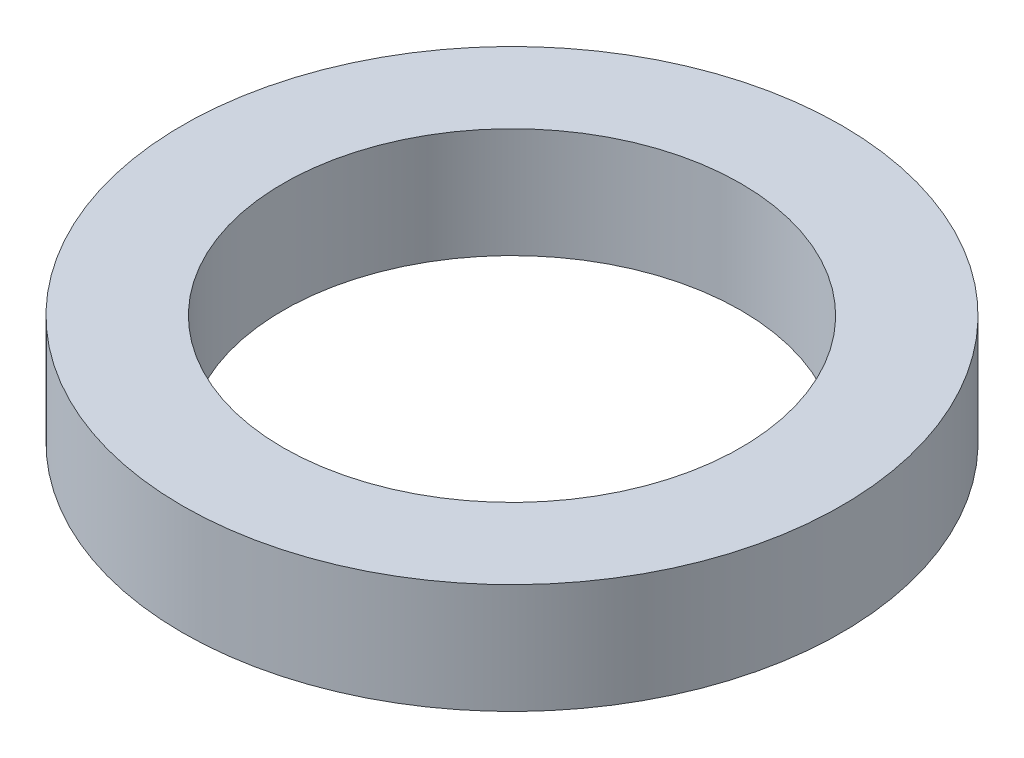
ISO-10303-21;
HEADER;
FILE_DESCRIPTION(('STEP AP214'),'2;1');
FILE_NAME('part.step','',(''),(''),'','','');
FILE_SCHEMA(('AUTOMOTIVE_DESIGN { 1 0 10303 214 1 1 1 1 }'));
ENDSEC;
DATA;
#1=APPLICATION_CONTEXT('core data for automotive mechanical design processes');
#2=APPLICATION_PROTOCOL_DEFINITION('international standard','automotive_design',2000,#1);
#3=PRODUCT_CONTEXT('',#1,'mechanical');
#4=PRODUCT('Part','Part','',(#3));
#5=PRODUCT_RELATED_PRODUCT_CATEGORY('part','',(#4));
#6=PRODUCT_DEFINITION_FORMATION('','',#4);
#7=PRODUCT_DEFINITION_CONTEXT('part definition',#1,'design');
#8=PRODUCT_DEFINITION('design','',#6,#7);
#9=PRODUCT_DEFINITION_SHAPE('','',#8);
#10=(LENGTH_UNIT() NAMED_UNIT(*) SI_UNIT(.MILLI.,.METRE.));
#11=(NAMED_UNIT(*) PLANE_ANGLE_UNIT() SI_UNIT($,.RADIAN.));
#12=(NAMED_UNIT(*) SI_UNIT($,.STERADIAN.) SOLID_ANGLE_UNIT());
#13=UNCERTAINTY_MEASURE_WITH_UNIT(LENGTH_MEASURE(1.E-05),#10,'distance_accuracy_value','');
#14=(GEOMETRIC_REPRESENTATION_CONTEXT(3) GLOBAL_UNCERTAINTY_ASSIGNED_CONTEXT((#13)) GLOBAL_UNIT_ASSIGNED_CONTEXT((#10,
#11,#12)) REPRESENTATION_CONTEXT('',''));
#15=CARTESIAN_POINT('',(0.,0.,0.));
#16=DIRECTION('',(0.,0.,1.));
#17=DIRECTION('',(1.,0.,0.));
#18=AXIS2_PLACEMENT_3D('',#15,#16,#17);
#19=CARTESIAN_POINT('',(0.,3.,0.));
#20=DIRECTION('',(0.,1.,0.));
#21=DIRECTION('',(0.,0.,1.));
#22=AXIS2_PLACEMENT_3D('',#19,#20,#21);
#23=PLANE('',#22);
#24=CARTESIAN_POINT('',(0.,3.,0.));
#25=DIRECTION('',(0.,1.,0.));
#26=DIRECTION('',(0.,0.,1.));
#27=AXIS2_PLACEMENT_3D('',#24,#25,#26);
#28=CIRCLE('',#27,9.);
#29=CARTESIAN_POINT('',(0.,3.,9.));
#30=VERTEX_POINT('',#29);
#31=EDGE_CURVE('E10',#30,#30,#28,.T.);
#32=ORIENTED_EDGE('',*,*,#31,.T.);
#33=EDGE_LOOP('',(#32));
#34=FACE_BOUND('',#33,.T.);
#35=CARTESIAN_POINT('',(0.,3.,0.));
#36=DIRECTION('',(0.,1.,0.));
#37=DIRECTION('',(0.,0.,1.));
#38=AXIS2_PLACEMENT_3D('',#35,#36,#37);
#39=CIRCLE('',#38,6.25);
#40=CARTESIAN_POINT('',(0.,3.,6.25));
#41=VERTEX_POINT('',#40);
#42=EDGE_CURVE('E42',#41,#41,#39,.T.);
#43=ORIENTED_EDGE('',*,*,#42,.F.);
#44=EDGE_LOOP('',(#43));
#45=FACE_BOUND('',#44,.T.);
#46=ADVANCED_FACE('F31',(#34,#45),#23,.T.);
#47=CARTESIAN_POINT('',(0.,0.,0.));
#48=DIRECTION('',(0.,1.,0.));
#49=DIRECTION('',(0.,0.,1.));
#50=AXIS2_PLACEMENT_3D('',#47,#48,#49);
#51=PLANE('',#50);
#52=CARTESIAN_POINT('',(0.,0.,0.));
#53=DIRECTION('',(0.,1.,0.));
#54=DIRECTION('',(0.,0.,1.));
#55=AXIS2_PLACEMENT_3D('',#52,#53,#54);
#56=CIRCLE('',#55,9.);
#57=CARTESIAN_POINT('',(0.,0.,9.));
#58=VERTEX_POINT('',#57);
#59=EDGE_CURVE('E35',#58,#58,#56,.T.);
#60=ORIENTED_EDGE('',*,*,#59,.F.);
#61=EDGE_LOOP('',(#60));
#62=FACE_BOUND('',#61,.T.);
#63=CARTESIAN_POINT('',(0.,0.,0.));
#64=DIRECTION('',(0.,1.,0.));
#65=DIRECTION('',(0.,0.,1.));
#66=AXIS2_PLACEMENT_3D('',#63,#64,#65);
#67=CIRCLE('',#66,6.25);
#68=CARTESIAN_POINT('',(0.,0.,6.25));
#69=VERTEX_POINT('',#68);
#70=EDGE_CURVE('E44',#69,#69,#67,.T.);
#71=ORIENTED_EDGE('',*,*,#70,.T.);
#72=EDGE_LOOP('',(#71));
#73=FACE_BOUND('',#72,.T.);
#74=ADVANCED_FACE('F54',(#62,#73),#51,.F.);
#75=CARTESIAN_POINT('',(0.,3.,0.));
#76=DIRECTION('',(0.,-1.,0.));
#77=DIRECTION('',(0.,0.,-1.));
#78=AXIS2_PLACEMENT_3D('',#75,#76,#77);
#79=CYLINDRICAL_SURFACE('',#78,9.);
#80=ORIENTED_EDGE('',*,*,#31,.F.);
#81=EDGE_LOOP('',(#80));
#82=FACE_BOUND('',#81,.T.);
#83=ORIENTED_EDGE('',*,*,#59,.T.);
#84=EDGE_LOOP('',(#83));
#85=FACE_BOUND('',#84,.T.);
#86=ADVANCED_FACE('F33',(#82,#85),#79,.T.);
#87=CARTESIAN_POINT('',(0.,3.,0.));
#88=DIRECTION('',(0.,-1.,0.));
#89=DIRECTION('',(0.,0.,-1.));
#90=AXIS2_PLACEMENT_3D('',#87,#88,#89);
#91=CYLINDRICAL_SURFACE('',#90,6.25);
#92=ORIENTED_EDGE('',*,*,#42,.T.);
#93=EDGE_LOOP('',(#92));
#94=FACE_BOUND('',#93,.T.);
#95=ORIENTED_EDGE('',*,*,#70,.F.);
#96=EDGE_LOOP('',(#95));
#97=FACE_BOUND('',#96,.T.);
#98=ADVANCED_FACE('F50',(#94,#97),#91,.F.);
#99=CLOSED_SHELL('',(#46,#74,#86,#98));
#100=MANIFOLD_SOLID_BREP('B2',#99);
#101=ADVANCED_BREP_SHAPE_REPRESENTATION('',(#18,#100),#14);
#102=SHAPE_DEFINITION_REPRESENTATION(#9,#101);
ENDSEC;
END-ISO-10303-21;
